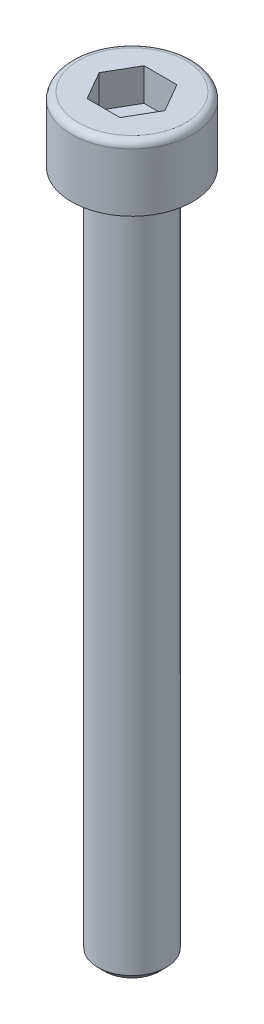
ISO-10303-21;
HEADER;
FILE_DESCRIPTION(('STEP AP214'),'2;1');
FILE_NAME('part.step','',(''),(''),'','','');
FILE_SCHEMA(('AUTOMOTIVE_DESIGN { 1 0 10303 214 1 1 1 1 }'));
ENDSEC;
DATA;
#1=APPLICATION_CONTEXT('core data for automotive mechanical design processes');
#2=APPLICATION_PROTOCOL_DEFINITION('international standard','automotive_design',2000,#1);
#3=PRODUCT_CONTEXT('',#1,'mechanical');
#4=PRODUCT('Part','Part','',(#3));
#5=PRODUCT_RELATED_PRODUCT_CATEGORY('part','',(#4));
#6=PRODUCT_DEFINITION_FORMATION('','',#4);
#7=PRODUCT_DEFINITION_CONTEXT('part definition',#1,'design');
#8=PRODUCT_DEFINITION('design','',#6,#7);
#9=PRODUCT_DEFINITION_SHAPE('','',#8);
#10=(LENGTH_UNIT() NAMED_UNIT(*) SI_UNIT(.MILLI.,.METRE.));
#11=(NAMED_UNIT(*) PLANE_ANGLE_UNIT() SI_UNIT($,.RADIAN.));
#12=(NAMED_UNIT(*) SI_UNIT($,.STERADIAN.) SOLID_ANGLE_UNIT());
#13=UNCERTAINTY_MEASURE_WITH_UNIT(LENGTH_MEASURE(1.E-05),#10,'distance_accuracy_value','');
#14=(GEOMETRIC_REPRESENTATION_CONTEXT(3) GLOBAL_UNCERTAINTY_ASSIGNED_CONTEXT((#13)) GLOBAL_UNIT_ASSIGNED_CONTEXT((#10,
#11,#12)) REPRESENTATION_CONTEXT('',''));
#15=CARTESIAN_POINT('',(0.,0.,0.));
#16=DIRECTION('',(0.,0.,1.));
#17=DIRECTION('',(1.,0.,0.));
#18=AXIS2_PLACEMENT_3D('',#15,#16,#17);
#19=CARTESIAN_POINT('',(1.5,-30.,0.));
#20=DIRECTION('',(0.,-1.,0.));
#21=DIRECTION('',(0.,0.,-1.));
#22=AXIS2_PLACEMENT_3D('',#19,#20,#21);
#23=PLANE('',#22);
#24=CARTESIAN_POINT('',(0.,-30.,0.));
#25=DIRECTION('',(0.,-1.,0.));
#26=DIRECTION('',(0.,0.,-1.));
#27=AXIS2_PLACEMENT_3D('',#24,#25,#26);
#28=CIRCLE('',#27,1.2);
#29=CARTESIAN_POINT('',(0.,-30.,-1.2));
#30=VERTEX_POINT('',#29);
#31=EDGE_CURVE('E147',#30,#30,#28,.T.);
#32=ORIENTED_EDGE('',*,*,#31,.T.);
#33=EDGE_LOOP('',(#32));
#34=FACE_BOUND('',#33,.T.);
#35=ADVANCED_FACE('F34',(#34),#23,.T.);
#36=CARTESIAN_POINT('',(0.,2.86,0.));
#37=DIRECTION('',(0.,1.,0.));
#38=DIRECTION('',(0.,0.,1.));
#39=AXIS2_PLACEMENT_3D('',#36,#37,#38);
#40=PLANE('',#39);
#41=DIRECTION('',(1.,0.,0.));
#42=VECTOR('',#41,1.);
#43=CARTESIAN_POINT('',(-0.721687836487032,2.86,1.25));
#44=LINE('',#43,#42);
#45=CARTESIAN_POINT('',(-0.721687836487032,2.86,1.25));
#46=VERTEX_POINT('',#45);
#47=CARTESIAN_POINT('',(0.721687836487033,2.86,1.25));
#48=VERTEX_POINT('',#47);
#49=EDGE_CURVE('E49',#46,#48,#44,.T.);
#50=ORIENTED_EDGE('',*,*,#49,.F.);
#51=DIRECTION('',(0.5,0.,0.866025403784439));
#52=VECTOR('',#51,1.);
#53=CARTESIAN_POINT('',(-1.44337567297406,2.86,0.));
#54=LINE('',#53,#52);
#55=CARTESIAN_POINT('',(-1.44337567297406,2.86,0.));
#56=VERTEX_POINT('',#55);
#57=EDGE_CURVE('E132',#56,#46,#54,.T.);
#58=ORIENTED_EDGE('',*,*,#57,.F.);
#59=DIRECTION('',(-0.5,0.,0.866025403784439));
#60=VECTOR('',#59,1.);
#61=CARTESIAN_POINT('',(-0.721687836487033,2.86,-1.25));
#62=LINE('',#61,#60);
#63=CARTESIAN_POINT('',(-0.721687836487033,2.86,-1.25));
#64=VERTEX_POINT('',#63);
#65=EDGE_CURVE('E130',#64,#56,#62,.T.);
#66=ORIENTED_EDGE('',*,*,#65,.F.);
#67=DIRECTION('',(-1.,0.,0.));
#68=VECTOR('',#67,1.);
#69=CARTESIAN_POINT('',(0.721687836487032,2.86,-1.25));
#70=LINE('',#69,#68);
#71=CARTESIAN_POINT('',(0.721687836487032,2.86,-1.25));
#72=VERTEX_POINT('',#71);
#73=EDGE_CURVE('E97',#72,#64,#70,.T.);
#74=ORIENTED_EDGE('',*,*,#73,.F.);
#75=DIRECTION('',(-0.5,0.,-0.866025403784438));
#76=VECTOR('',#75,1.);
#77=CARTESIAN_POINT('',(1.44337567297406,2.86,0.));
#78=LINE('',#77,#76);
#79=CARTESIAN_POINT('',(1.44337567297406,2.86,0.));
#80=VERTEX_POINT('',#79);
#81=EDGE_CURVE('E126',#80,#72,#78,.T.);
#82=ORIENTED_EDGE('',*,*,#81,.F.);
#83=DIRECTION('',(0.5,0.,-0.866025403784439));
#84=VECTOR('',#83,1.);
#85=CARTESIAN_POINT('',(0.721687836487033,2.86,1.25));
#86=LINE('',#85,#84);
#87=EDGE_CURVE('E123',#48,#80,#86,.T.);
#88=ORIENTED_EDGE('',*,*,#87,.F.);
#89=EDGE_LOOP('',(#50,#58,#66,#74,#82,#88));
#90=FACE_BOUND('',#89,.T.);
#91=CARTESIAN_POINT('',(0.,2.86,0.));
#92=DIRECTION('',(0.,1.,0.));
#93=DIRECTION('',(0.,0.,1.));
#94=AXIS2_PLACEMENT_3D('',#91,#92,#93);
#95=CIRCLE('',#94,2.36);
#96=CARTESIAN_POINT('',(0.,2.86,2.36));
#97=VERTEX_POINT('',#96);
#98=EDGE_CURVE('E11',#97,#97,#95,.T.);
#99=ORIENTED_EDGE('',*,*,#98,.T.);
#100=EDGE_LOOP('',(#99));
#101=FACE_BOUND('',#100,.T.);
#102=ADVANCED_FACE('F172',(#90,#101),#40,.T.);
#103=CARTESIAN_POINT('',(0.,2.86,0.));
#104=DIRECTION('',(0.,-1.,0.));
#105=DIRECTION('',(0.,0.,-1.));
#106=AXIS2_PLACEMENT_3D('',#103,#104,#105);
#107=CYLINDRICAL_SURFACE('',#106,2.66);
#108=CARTESIAN_POINT('',(0.,2.56,0.));
#109=DIRECTION('',(0.,1.,0.));
#110=DIRECTION('',(0.,0.,1.));
#111=AXIS2_PLACEMENT_3D('',#108,#109,#110);
#112=CIRCLE('',#111,2.66);
#113=CARTESIAN_POINT('',(0.,2.56,2.66));
#114=VERTEX_POINT('',#113);
#115=EDGE_CURVE('E42',#114,#114,#112,.F.);
#116=ORIENTED_EDGE('',*,*,#115,.T.);
#117=EDGE_LOOP('',(#116));
#118=FACE_BOUND('',#117,.T.);
#119=CARTESIAN_POINT('',(0.,0.,0.));
#120=DIRECTION('',(0.,-1.,0.));
#121=DIRECTION('',(0.,0.,-1.));
#122=AXIS2_PLACEMENT_3D('',#119,#120,#121);
#123=CIRCLE('',#122,2.66);
#124=CARTESIAN_POINT('',(0.,0.,-2.66));
#125=VERTEX_POINT('',#124);
#126=EDGE_CURVE('E144',#125,#125,#123,.T.);
#127=ORIENTED_EDGE('',*,*,#126,.F.);
#128=EDGE_LOOP('',(#127));
#129=FACE_BOUND('',#128,.T.);
#130=ADVANCED_FACE('F155',(#118,#129),#107,.T.);
#131=CARTESIAN_POINT('',(2.66,0.,0.));
#132=DIRECTION('',(0.,-1.,0.));
#133=DIRECTION('',(0.,0.,-1.));
#134=AXIS2_PLACEMENT_3D('',#131,#132,#133);
#135=PLANE('',#134);
#136=ORIENTED_EDGE('',*,*,#126,.T.);
#137=EDGE_LOOP('',(#136));
#138=FACE_BOUND('',#137,.T.);
#139=CARTESIAN_POINT('',(0.,0.,0.));
#140=DIRECTION('',(0.,-1.,0.));
#141=DIRECTION('',(0.,0.,-1.));
#142=AXIS2_PLACEMENT_3D('',#139,#140,#141);
#143=CIRCLE('',#142,1.5);
#144=CARTESIAN_POINT('',(0.,0.,-1.5));
#145=VERTEX_POINT('',#144);
#146=EDGE_CURVE('E136',#145,#145,#143,.T.);
#147=ORIENTED_EDGE('',*,*,#146,.F.);
#148=EDGE_LOOP('',(#147));
#149=FACE_BOUND('',#148,.T.);
#150=ADVANCED_FACE('F183',(#138,#149),#135,.T.);
#151=CARTESIAN_POINT('',(0.,2.86,0.));
#152=DIRECTION('',(0.,-1.,0.));
#153=DIRECTION('',(0.,0.,-1.));
#154=AXIS2_PLACEMENT_3D('',#151,#152,#153);
#155=CYLINDRICAL_SURFACE('',#154,1.5);
#156=CARTESIAN_POINT('',(0.,-29.7,0.));
#157=DIRECTION('',(0.,-1.,0.));
#158=DIRECTION('',(0.,0.,-1.));
#159=AXIS2_PLACEMENT_3D('',#156,#157,#158);
#160=CIRCLE('',#159,1.5);
#161=CARTESIAN_POINT('',(0.,-29.7,-1.5));
#162=VERTEX_POINT('',#161);
#163=EDGE_CURVE('E150',#162,#162,#160,.F.);
#164=ORIENTED_EDGE('',*,*,#163,.T.);
#165=EDGE_LOOP('',(#164));
#166=FACE_BOUND('',#165,.T.);
#167=ORIENTED_EDGE('',*,*,#146,.T.);
#168=EDGE_LOOP('',(#167));
#169=FACE_BOUND('',#168,.T.);
#170=ADVANCED_FACE('F168',(#166,#169),#155,.T.);
#171=CARTESIAN_POINT('',(0.,-30.,0.));
#172=DIRECTION('',(0.,1.,0.));
#173=DIRECTION('',(0.,0.,1.));
#174=AXIS2_PLACEMENT_3D('',#171,#172,#173);
#175=CONICAL_SURFACE('',#174,1.2,0.785398163397438);
#176=ORIENTED_EDGE('',*,*,#163,.F.);
#177=EDGE_LOOP('',(#176));
#178=FACE_BOUND('',#177,.T.);
#179=ORIENTED_EDGE('',*,*,#31,.F.);
#180=EDGE_LOOP('',(#179));
#181=FACE_BOUND('',#180,.T.);
#182=ADVANCED_FACE('F160',(#178,#181),#175,.T.);
#183=CARTESIAN_POINT('',(0.,2.56,0.));
#184=DIRECTION('',(0.,1.,0.));
#185=DIRECTION('',(0.,0.,1.));
#186=AXIS2_PLACEMENT_3D('',#183,#184,#185);
#187=TOROIDAL_SURFACE('',#186,2.36,0.3);
#188=ORIENTED_EDGE('',*,*,#98,.F.);
#189=EDGE_LOOP('',(#188));
#190=FACE_BOUND('',#189,.T.);
#191=ORIENTED_EDGE('',*,*,#115,.F.);
#192=EDGE_LOOP('',(#191));
#193=FACE_BOUND('',#192,.T.);
#194=ADVANCED_FACE('F36',(#190,#193),#187,.T.);
#195=CARTESIAN_POINT('',(-0.721687836487032,1.43,1.25));
#196=DIRECTION('',(0.,0.,1.));
#197=DIRECTION('',(1.,0.,0.));
#198=AXIS2_PLACEMENT_3D('',#195,#196,#197);
#199=PLANE('',#198);
#200=ORIENTED_EDGE('',*,*,#49,.T.);
#201=DIRECTION('',(0.,1.,0.));
#202=VECTOR('',#201,1.);
#203=CARTESIAN_POINT('',(0.721687836487033,1.43,1.25));
#204=LINE('',#203,#202);
#205=CARTESIAN_POINT('',(0.721687836487033,1.43,1.25));
#206=VERTEX_POINT('',#205);
#207=EDGE_CURVE('E79',#206,#48,#204,.T.);
#208=ORIENTED_EDGE('',*,*,#207,.F.);
#209=DIRECTION('',(1.,0.,0.));
#210=VECTOR('',#209,1.);
#211=CARTESIAN_POINT('',(-0.721687836487032,1.43,1.25));
#212=LINE('',#211,#210);
#213=CARTESIAN_POINT('',(-0.721687836487032,1.43,1.25));
#214=VERTEX_POINT('',#213);
#215=EDGE_CURVE('E134',#214,#206,#212,.T.);
#216=ORIENTED_EDGE('',*,*,#215,.F.);
#217=DIRECTION('',(0.,1.,0.));
#218=VECTOR('',#217,1.);
#219=CARTESIAN_POINT('',(-0.721687836487032,1.43,1.25));
#220=LINE('',#219,#218);
#221=EDGE_CURVE('E57',#214,#46,#220,.T.);
#222=ORIENTED_EDGE('',*,*,#221,.T.);
#223=EDGE_LOOP('',(#200,#208,#216,#222));
#224=FACE_BOUND('',#223,.T.);
#225=ADVANCED_FACE('F159',(#224),#199,.F.);
#226=CARTESIAN_POINT('',(-1.44337567297406,1.43,0.));
#227=DIRECTION('',(-0.866025403784439,0.,0.5));
#228=DIRECTION('',(0.5,0.,0.866025403784439));
#229=AXIS2_PLACEMENT_3D('',#226,#227,#228);
#230=PLANE('',#229);
#231=ORIENTED_EDGE('',*,*,#57,.T.);
#232=ORIENTED_EDGE('',*,*,#221,.F.);
#233=DIRECTION('',(0.5,0.,0.866025403784439));
#234=VECTOR('',#233,1.);
#235=CARTESIAN_POINT('',(-1.44337567297406,1.43,0.));
#236=LINE('',#235,#234);
#237=CARTESIAN_POINT('',(-1.44337567297406,1.43,0.));
#238=VERTEX_POINT('',#237);
#239=EDGE_CURVE('E109',#238,#214,#236,.T.);
#240=ORIENTED_EDGE('',*,*,#239,.F.);
#241=DIRECTION('',(0.,1.,0.));
#242=VECTOR('',#241,1.);
#243=CARTESIAN_POINT('',(-1.44337567297406,1.43,0.));
#244=LINE('',#243,#242);
#245=EDGE_CURVE('E101',#238,#56,#244,.T.);
#246=ORIENTED_EDGE('',*,*,#245,.T.);
#247=EDGE_LOOP('',(#231,#232,#240,#246));
#248=FACE_BOUND('',#247,.T.);
#249=ADVANCED_FACE('F166',(#248),#230,.F.);
#250=CARTESIAN_POINT('',(-0.721687836487033,1.43,-1.25));
#251=DIRECTION('',(-0.866025403784439,0.,-0.5));
#252=DIRECTION('',(-0.5,0.,0.866025403784439));
#253=AXIS2_PLACEMENT_3D('',#250,#251,#252);
#254=PLANE('',#253);
#255=ORIENTED_EDGE('',*,*,#65,.T.);
#256=ORIENTED_EDGE('',*,*,#245,.F.);
#257=DIRECTION('',(-0.5,0.,0.866025403784439));
#258=VECTOR('',#257,1.);
#259=CARTESIAN_POINT('',(-0.721687836487033,1.43,-1.25));
#260=LINE('',#259,#258);
#261=CARTESIAN_POINT('',(-0.721687836487033,1.43,-1.25));
#262=VERTEX_POINT('',#261);
#263=EDGE_CURVE('E105',#262,#238,#260,.T.);
#264=ORIENTED_EDGE('',*,*,#263,.F.);
#265=DIRECTION('',(0.,1.,0.));
#266=VECTOR('',#265,1.);
#267=CARTESIAN_POINT('',(-0.721687836487033,1.43,-1.25));
#268=LINE('',#267,#266);
#269=EDGE_CURVE('E90',#262,#64,#268,.T.);
#270=ORIENTED_EDGE('',*,*,#269,.T.);
#271=EDGE_LOOP('',(#255,#256,#264,#270));
#272=FACE_BOUND('',#271,.T.);
#273=ADVANCED_FACE('F106',(#272),#254,.F.);
#274=CARTESIAN_POINT('',(0.721687836487032,1.43,-1.25));
#275=DIRECTION('',(0.,0.,-1.));
#276=DIRECTION('',(-1.,0.,0.));
#277=AXIS2_PLACEMENT_3D('',#274,#275,#276);
#278=PLANE('',#277);
#279=ORIENTED_EDGE('',*,*,#73,.T.);
#280=ORIENTED_EDGE('',*,*,#269,.F.);
#281=DIRECTION('',(-1.,0.,0.));
#282=VECTOR('',#281,1.);
#283=CARTESIAN_POINT('',(0.721687836487032,1.43,-1.25));
#284=LINE('',#283,#282);
#285=CARTESIAN_POINT('',(0.721687836487032,1.43,-1.25));
#286=VERTEX_POINT('',#285);
#287=EDGE_CURVE('E94',#286,#262,#284,.T.);
#288=ORIENTED_EDGE('',*,*,#287,.F.);
#289=DIRECTION('',(0.,1.,0.));
#290=VECTOR('',#289,1.);
#291=CARTESIAN_POINT('',(0.721687836487032,1.43,-1.25));
#292=LINE('',#291,#290);
#293=EDGE_CURVE('E102',#286,#72,#292,.T.);
#294=ORIENTED_EDGE('',*,*,#293,.T.);
#295=EDGE_LOOP('',(#279,#280,#288,#294));
#296=FACE_BOUND('',#295,.T.);
#297=ADVANCED_FACE('F92',(#296),#278,.F.);
#298=CARTESIAN_POINT('',(1.44337567297406,1.43,0.));
#299=DIRECTION('',(0.866025403784438,0.,-0.5));
#300=DIRECTION('',(-0.5,0.,-0.866025403784438));
#301=AXIS2_PLACEMENT_3D('',#298,#299,#300);
#302=PLANE('',#301);
#303=ORIENTED_EDGE('',*,*,#81,.T.);
#304=ORIENTED_EDGE('',*,*,#293,.F.);
#305=DIRECTION('',(-0.5,0.,-0.866025403784438));
#306=VECTOR('',#305,1.);
#307=CARTESIAN_POINT('',(1.44337567297406,1.43,0.));
#308=LINE('',#307,#306);
#309=CARTESIAN_POINT('',(1.44337567297406,1.43,0.));
#310=VERTEX_POINT('',#309);
#311=EDGE_CURVE('E115',#310,#286,#308,.T.);
#312=ORIENTED_EDGE('',*,*,#311,.F.);
#313=DIRECTION('',(0.,1.,0.));
#314=VECTOR('',#313,1.);
#315=CARTESIAN_POINT('',(1.44337567297406,1.43,0.));
#316=LINE('',#315,#314);
#317=EDGE_CURVE('E139',#310,#80,#316,.T.);
#318=ORIENTED_EDGE('',*,*,#317,.T.);
#319=EDGE_LOOP('',(#303,#304,#312,#318));
#320=FACE_BOUND('',#319,.T.);
#321=ADVANCED_FACE('F193',(#320),#302,.F.);
#322=CARTESIAN_POINT('',(0.721687836487033,1.43,1.25));
#323=DIRECTION('',(0.866025403784439,0.,0.5));
#324=DIRECTION('',(0.5,0.,-0.866025403784439));
#325=AXIS2_PLACEMENT_3D('',#322,#323,#324);
#326=PLANE('',#325);
#327=ORIENTED_EDGE('',*,*,#87,.T.);
#328=ORIENTED_EDGE('',*,*,#317,.F.);
#329=DIRECTION('',(0.5,0.,-0.866025403784439));
#330=VECTOR('',#329,1.);
#331=CARTESIAN_POINT('',(0.721687836487033,1.43,1.25));
#332=LINE('',#331,#330);
#333=EDGE_CURVE('E117',#206,#310,#332,.T.);
#334=ORIENTED_EDGE('',*,*,#333,.F.);
#335=ORIENTED_EDGE('',*,*,#207,.T.);
#336=EDGE_LOOP('',(#327,#328,#334,#335));
#337=FACE_BOUND('',#336,.T.);
#338=ADVANCED_FACE('F190',(#337),#326,.F.);
#339=CARTESIAN_POINT('',(0.,1.43,0.));
#340=DIRECTION('',(0.,1.,0.));
#341=DIRECTION('',(0.,0.,1.));
#342=AXIS2_PLACEMENT_3D('',#339,#340,#341);
#343=PLANE('',#342);
#344=ORIENTED_EDGE('',*,*,#215,.T.);
#345=ORIENTED_EDGE('',*,*,#333,.T.);
#346=ORIENTED_EDGE('',*,*,#311,.T.);
#347=ORIENTED_EDGE('',*,*,#287,.T.);
#348=ORIENTED_EDGE('',*,*,#263,.T.);
#349=ORIENTED_EDGE('',*,*,#239,.T.);
#350=EDGE_LOOP('',(#344,#345,#346,#347,#348,#349));
#351=FACE_BOUND('',#350,.T.);
#352=ADVANCED_FACE('F112',(#351),#343,.T.);
#353=CLOSED_SHELL('',(#35,#102,#130,#150,#170,#182,#194,#225,#249,#273,#297,#321,#338,#352));
#354=MANIFOLD_SOLID_BREP('B2',#353);
#355=ADVANCED_BREP_SHAPE_REPRESENTATION('',(#18,#354),#14);
#356=SHAPE_DEFINITION_REPRESENTATION(#9,#355);
ENDSEC;
END-ISO-10303-21;
